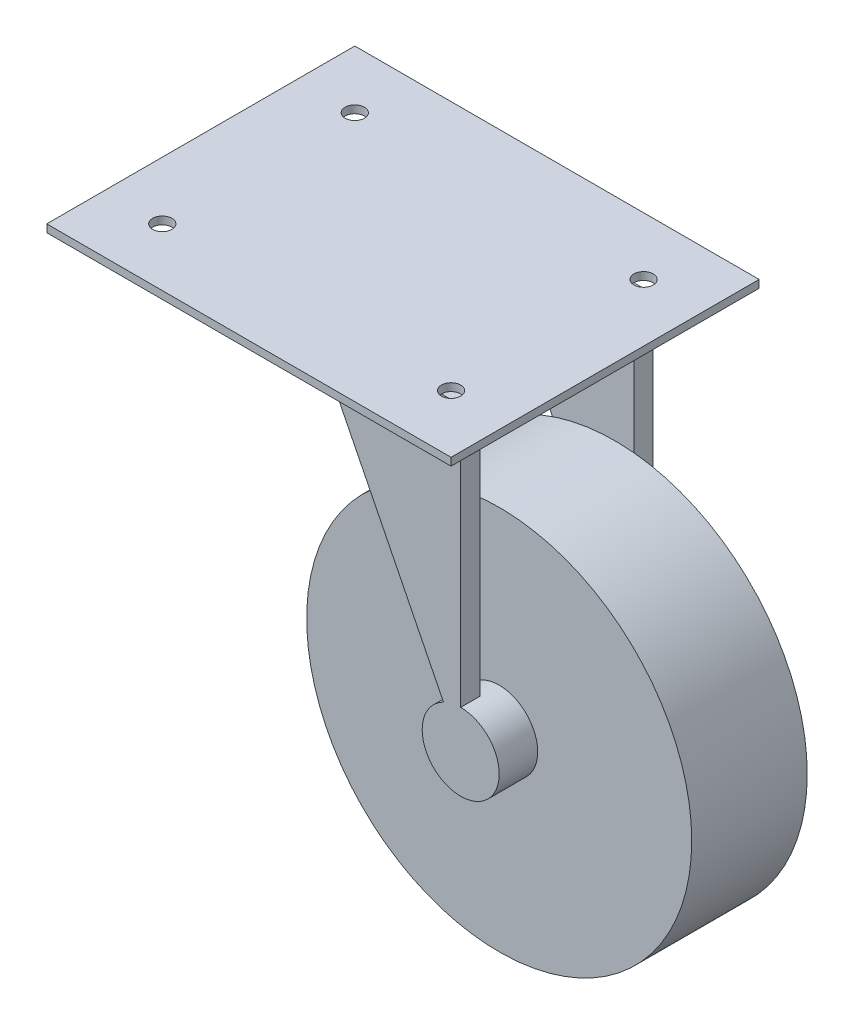
ISO-10303-21;
HEADER;
FILE_DESCRIPTION(('STEP AP214'),'2;1');
FILE_NAME('part.step','',(''),(''),'','','');
FILE_SCHEMA(('AUTOMOTIVE_DESIGN { 1 0 10303 214 1 1 1 1 }'));
ENDSEC;
DATA;
#1=APPLICATION_CONTEXT('core data for automotive mechanical design processes');
#2=APPLICATION_PROTOCOL_DEFINITION('international standard','automotive_design',2000,#1);
#3=PRODUCT_CONTEXT('',#1,'mechanical');
#4=PRODUCT('Part','Part','',(#3));
#5=PRODUCT_RELATED_PRODUCT_CATEGORY('part','',(#4));
#6=PRODUCT_DEFINITION_FORMATION('','',#4);
#7=PRODUCT_DEFINITION_CONTEXT('part definition',#1,'design');
#8=PRODUCT_DEFINITION('design','',#6,#7);
#9=PRODUCT_DEFINITION_SHAPE('','',#8);
#10=(LENGTH_UNIT() NAMED_UNIT(*) SI_UNIT(.MILLI.,.METRE.));
#11=(NAMED_UNIT(*) PLANE_ANGLE_UNIT() SI_UNIT($,.RADIAN.));
#12=(NAMED_UNIT(*) SI_UNIT($,.STERADIAN.) SOLID_ANGLE_UNIT());
#13=UNCERTAINTY_MEASURE_WITH_UNIT(LENGTH_MEASURE(1.E-05),#10,'distance_accuracy_value','');
#14=(GEOMETRIC_REPRESENTATION_CONTEXT(3) GLOBAL_UNCERTAINTY_ASSIGNED_CONTEXT((#13)) GLOBAL_UNIT_ASSIGNED_CONTEXT((#10,
#11,#12)) REPRESENTATION_CONTEXT('',''));
#15=CARTESIAN_POINT('',(0.,0.,0.));
#16=DIRECTION('',(0.,0.,1.));
#17=DIRECTION('',(1.,0.,0.));
#18=AXIS2_PLACEMENT_3D('',#15,#16,#17);
#19=CARTESIAN_POINT('',(0.,0.,35.));
#20=DIRECTION('',(0.,0.,1.));
#21=DIRECTION('',(1.,0.,0.));
#22=AXIS2_PLACEMENT_3D('',#19,#20,#21);
#23=PLANE('',#22);
#24=DIRECTION('',(-1.,0.,0.));
#25=VECTOR('',#24,1.);
#26=CARTESIAN_POINT('',(0.,78.,35.));
#27=LINE('',#26,#25);
#28=CARTESIAN_POINT('',(0.,78.,35.));
#29=VERTEX_POINT('',#28);
#30=CARTESIAN_POINT('',(-39.,78.,35.));
#31=VERTEX_POINT('',#30);
#32=EDGE_CURVE('E173',#29,#31,#27,.T.);
#33=ORIENTED_EDGE('',*,*,#32,.F.);
#34=DIRECTION('',(0.,1.,0.));
#35=VECTOR('',#34,1.);
#36=CARTESIAN_POINT('',(0.,0.,35.));
#37=LINE('',#36,#35);
#38=CARTESIAN_POINT('',(0.,10.,35.));
#39=VERTEX_POINT('',#38);
#40=EDGE_CURVE('E207',#39,#29,#37,.T.);
#41=ORIENTED_EDGE('',*,*,#40,.F.);
#42=CARTESIAN_POINT('',(0.,0.,35.));
#43=DIRECTION('',(0.,0.,1.));
#44=DIRECTION('',(1.,0.,0.));
#45=AXIS2_PLACEMENT_3D('',#42,#43,#44);
#46=CIRCLE('',#45,10.);
#47=CARTESIAN_POINT('',(-4.47213595499958,8.94427190999916,35.));
#48=VERTEX_POINT('',#47);
#49=EDGE_CURVE('E228',#39,#48,#46,.T.);
#50=ORIENTED_EDGE('',*,*,#49,.T.);
#51=DIRECTION('',(0.447213595499958,-0.894427190999916,0.));
#52=VECTOR('',#51,1.);
#53=CARTESIAN_POINT('',(0.,0.,35.));
#54=LINE('',#53,#52);
#55=EDGE_CURVE('E202',#31,#48,#54,.T.);
#56=ORIENTED_EDGE('',*,*,#55,.F.);
#57=EDGE_LOOP('',(#33,#41,#50,#56));
#58=FACE_BOUND('',#57,.T.);
#59=ADVANCED_FACE('F41',(#58),#23,.F.);
#60=CARTESIAN_POINT('',(0.,0.,40.));
#61=DIRECTION('',(0.894427190999916,0.447213595499958,0.));
#62=DIRECTION('',(-0.447213595499958,0.894427190999916,0.));
#63=AXIS2_PLACEMENT_3D('',#60,#61,#62);
#64=PLANE('',#63);
#65=DIRECTION('',(0.,0.,1.));
#66=VECTOR('',#65,1.);
#67=CARTESIAN_POINT('',(-39.,78.,40.));
#68=LINE('',#67,#66);
#69=CARTESIAN_POINT('',(-39.,78.,40.));
#70=VERTEX_POINT('',#69);
#71=EDGE_CURVE('E155',#31,#70,#68,.T.);
#72=ORIENTED_EDGE('',*,*,#71,.F.);
#73=ORIENTED_EDGE('',*,*,#55,.T.);
#74=DIRECTION('',(0.,0.,-1.));
#75=VECTOR('',#74,1.);
#76=CARTESIAN_POINT('',(-4.47213595499958,8.94427190999916,40.));
#77=LINE('',#76,#75);
#78=CARTESIAN_POINT('',(-4.47213595499958,8.94427190999916,40.));
#79=VERTEX_POINT('',#78);
#80=EDGE_CURVE('E221',#79,#48,#77,.T.);
#81=ORIENTED_EDGE('',*,*,#80,.F.);
#82=DIRECTION('',(0.447213595499958,-0.894427190999916,0.));
#83=VECTOR('',#82,1.);
#84=CARTESIAN_POINT('',(0.,0.,40.));
#85=LINE('',#84,#83);
#86=EDGE_CURVE('E203',#70,#79,#85,.T.);
#87=ORIENTED_EDGE('',*,*,#86,.F.);
#88=EDGE_LOOP('',(#72,#73,#81,#87));
#89=FACE_BOUND('',#88,.T.);
#90=ADVANCED_FACE('F265',(#89),#64,.F.);
#91=CARTESIAN_POINT('',(0.,0.,40.));
#92=DIRECTION('',(-1.,0.,0.));
#93=DIRECTION('',(0.,0.,1.));
#94=AXIS2_PLACEMENT_3D('',#91,#92,#93);
#95=PLANE('',#94);
#96=DIRECTION('',(0.,0.,-1.));
#97=VECTOR('',#96,1.);
#98=CARTESIAN_POINT('',(0.,78.,40.));
#99=LINE('',#98,#97);
#100=CARTESIAN_POINT('',(0.,78.,40.));
#101=VERTEX_POINT('',#100);
#102=EDGE_CURVE('E165',#101,#29,#99,.T.);
#103=ORIENTED_EDGE('',*,*,#102,.F.);
#104=DIRECTION('',(0.,1.,0.));
#105=VECTOR('',#104,1.);
#106=CARTESIAN_POINT('',(0.,0.,40.));
#107=LINE('',#106,#105);
#108=CARTESIAN_POINT('',(0.,10.,40.));
#109=VERTEX_POINT('',#108);
#110=EDGE_CURVE('E163',#109,#101,#107,.T.);
#111=ORIENTED_EDGE('',*,*,#110,.F.);
#112=DIRECTION('',(0.,0.,-1.));
#113=VECTOR('',#112,1.);
#114=CARTESIAN_POINT('',(0.,10.,40.));
#115=LINE('',#114,#113);
#116=EDGE_CURVE('E212',#109,#39,#115,.T.);
#117=ORIENTED_EDGE('',*,*,#116,.T.);
#118=ORIENTED_EDGE('',*,*,#40,.T.);
#119=EDGE_LOOP('',(#103,#111,#117,#118));
#120=FACE_BOUND('',#119,.T.);
#121=ADVANCED_FACE('F271',(#120),#95,.F.);
#122=CARTESIAN_POINT('',(0.,0.,40.));
#123=DIRECTION('',(0.,0.,1.));
#124=DIRECTION('',(1.,0.,0.));
#125=AXIS2_PLACEMENT_3D('',#122,#123,#124);
#126=PLANE('',#125);
#127=ORIENTED_EDGE('',*,*,#110,.T.);
#128=DIRECTION('',(-1.,0.,0.));
#129=VECTOR('',#128,1.);
#130=CARTESIAN_POINT('',(0.,78.,40.));
#131=LINE('',#130,#129);
#132=CARTESIAN_POINT('',(-5.00000000000001,78.,40.));
#133=VERTEX_POINT('',#132);
#134=EDGE_CURVE('E140',#101,#133,#131,.T.);
#135=ORIENTED_EDGE('',*,*,#134,.T.);
#136=EDGE_CURVE('E64',#133,#70,#131,.T.);
#137=ORIENTED_EDGE('',*,*,#136,.T.);
#138=ORIENTED_EDGE('',*,*,#86,.T.);
#139=CARTESIAN_POINT('',(0.,0.,40.));
#140=DIRECTION('',(0.,0.,1.));
#141=DIRECTION('',(1.,0.,0.));
#142=AXIS2_PLACEMENT_3D('',#139,#140,#141);
#143=CIRCLE('',#142,10.);
#144=EDGE_CURVE('E206',#79,#109,#143,.T.);
#145=ORIENTED_EDGE('',*,*,#144,.T.);
#146=EDGE_LOOP('',(#127,#135,#137,#138,#145));
#147=FACE_BOUND('',#146,.T.);
#148=ADVANCED_FACE('F161',(#147),#126,.T.);
#149=CARTESIAN_POINT('',(0.,0.,-5.));
#150=DIRECTION('',(0.,0.,-1.));
#151=DIRECTION('',(-1.,0.,0.));
#152=AXIS2_PLACEMENT_3D('',#149,#150,#151);
#153=PLANE('',#152);
#154=DIRECTION('',(1.,0.,0.));
#155=VECTOR('',#154,1.);
#156=CARTESIAN_POINT('',(0.,78.,-5.));
#157=LINE('',#156,#155);
#158=CARTESIAN_POINT('',(-39.,78.,-5.));
#159=VERTEX_POINT('',#158);
#160=CARTESIAN_POINT('',(0.,78.,-5.));
#161=VERTEX_POINT('',#160);
#162=EDGE_CURVE('E158',#159,#161,#157,.T.);
#163=ORIENTED_EDGE('',*,*,#162,.F.);
#164=DIRECTION('',(0.447213595499958,-0.894427190999916,0.));
#165=VECTOR('',#164,1.);
#166=CARTESIAN_POINT('',(0.,0.,-5.));
#167=LINE('',#166,#165);
#168=CARTESIAN_POINT('',(-4.47213595499958,8.94427190999916,-5.));
#169=VERTEX_POINT('',#168);
#170=EDGE_CURVE('E176',#159,#169,#167,.T.);
#171=ORIENTED_EDGE('',*,*,#170,.T.);
#172=CARTESIAN_POINT('',(0.,0.,-5.));
#173=DIRECTION('',(0.,0.,-1.));
#174=DIRECTION('',(-1.,0.,0.));
#175=AXIS2_PLACEMENT_3D('',#172,#173,#174);
#176=CIRCLE('',#175,10.);
#177=CARTESIAN_POINT('',(0.,10.,-5.));
#178=VERTEX_POINT('',#177);
#179=EDGE_CURVE('E225',#169,#178,#176,.T.);
#180=ORIENTED_EDGE('',*,*,#179,.T.);
#181=DIRECTION('',(0.,1.,0.));
#182=VECTOR('',#181,1.);
#183=CARTESIAN_POINT('',(0.,0.,-5.));
#184=LINE('',#183,#182);
#185=EDGE_CURVE('E181',#178,#161,#184,.T.);
#186=ORIENTED_EDGE('',*,*,#185,.T.);
#187=EDGE_LOOP('',(#163,#171,#180,#186));
#188=FACE_BOUND('',#187,.T.);
#189=ADVANCED_FACE('F317',(#188),#153,.F.);
#190=CARTESIAN_POINT('',(0.,0.,-10.));
#191=DIRECTION('',(-0.894427190999916,-0.447213595499958,0.));
#192=DIRECTION('',(0.447213595499958,-0.894427190999916,0.));
#193=AXIS2_PLACEMENT_3D('',#190,#191,#192);
#194=PLANE('',#193);
#195=ORIENTED_EDGE('',*,*,#170,.F.);
#196=DIRECTION('',(0.,0.,-1.));
#197=VECTOR('',#196,1.);
#198=CARTESIAN_POINT('',(-39.,78.,-10.));
#199=LINE('',#198,#197);
#200=CARTESIAN_POINT('',(-39.,78.,-10.));
#201=VERTEX_POINT('',#200);
#202=EDGE_CURVE('E306',#159,#201,#199,.T.);
#203=ORIENTED_EDGE('',*,*,#202,.T.);
#204=DIRECTION('',(0.447213595499958,-0.894427190999916,0.));
#205=VECTOR('',#204,1.);
#206=CARTESIAN_POINT('',(0.,0.,-10.));
#207=LINE('',#206,#205);
#208=CARTESIAN_POINT('',(-4.47213595499958,8.94427190999916,-10.));
#209=VERTEX_POINT('',#208);
#210=EDGE_CURVE('E177',#201,#209,#207,.T.);
#211=ORIENTED_EDGE('',*,*,#210,.T.);
#212=DIRECTION('',(0.,0.,1.));
#213=VECTOR('',#212,1.);
#214=CARTESIAN_POINT('',(-4.47213595499958,8.94427190999916,-10.));
#215=LINE('',#214,#213);
#216=EDGE_CURVE('E189',#209,#169,#215,.T.);
#217=ORIENTED_EDGE('',*,*,#216,.T.);
#218=EDGE_LOOP('',(#195,#203,#211,#217));
#219=FACE_BOUND('',#218,.T.);
#220=ADVANCED_FACE('F303',(#219),#194,.T.);
#221=CARTESIAN_POINT('',(0.,0.,-10.));
#222=DIRECTION('',(1.,0.,0.));
#223=DIRECTION('',(0.,0.,-1.));
#224=AXIS2_PLACEMENT_3D('',#221,#222,#223);
#225=PLANE('',#224);
#226=DIRECTION('',(0.,1.,0.));
#227=VECTOR('',#226,1.);
#228=CARTESIAN_POINT('',(0.,0.,-10.));
#229=LINE('',#228,#227);
#230=CARTESIAN_POINT('',(0.,10.,-10.));
#231=VERTEX_POINT('',#230);
#232=CARTESIAN_POINT('',(0.,78.,-9.99999999999999));
#233=VERTEX_POINT('',#232);
#234=EDGE_CURVE('E180',#231,#233,#229,.T.);
#235=ORIENTED_EDGE('',*,*,#234,.T.);
#236=DIRECTION('',(0.,0.,1.));
#237=VECTOR('',#236,1.);
#238=CARTESIAN_POINT('',(0.,78.,-10.));
#239=LINE('',#238,#237);
#240=EDGE_CURVE('E315',#233,#161,#239,.T.);
#241=ORIENTED_EDGE('',*,*,#240,.T.);
#242=ORIENTED_EDGE('',*,*,#185,.F.);
#243=DIRECTION('',(0.,0.,1.));
#244=VECTOR('',#243,1.);
#245=CARTESIAN_POINT('',(0.,10.,-10.));
#246=LINE('',#245,#244);
#247=EDGE_CURVE('E198',#231,#178,#246,.T.);
#248=ORIENTED_EDGE('',*,*,#247,.F.);
#249=EDGE_LOOP('',(#235,#241,#242,#248));
#250=FACE_BOUND('',#249,.T.);
#251=ADVANCED_FACE('F314',(#250),#225,.T.);
#252=CARTESIAN_POINT('',(0.,0.,-10.));
#253=DIRECTION('',(0.,0.,-1.));
#254=DIRECTION('',(-1.,0.,0.));
#255=AXIS2_PLACEMENT_3D('',#252,#253,#254);
#256=PLANE('',#255);
#257=ORIENTED_EDGE('',*,*,#210,.F.);
#258=DIRECTION('',(1.,0.,0.));
#259=VECTOR('',#258,1.);
#260=CARTESIAN_POINT('',(0.,78.,-10.));
#261=LINE('',#260,#259);
#262=CARTESIAN_POINT('',(-5.00000000000001,78.,-10.));
#263=VERTEX_POINT('',#262);
#264=EDGE_CURVE('E11',#201,#263,#261,.T.);
#265=ORIENTED_EDGE('',*,*,#264,.T.);
#266=EDGE_CURVE('E50',#263,#233,#261,.T.);
#267=ORIENTED_EDGE('',*,*,#266,.T.);
#268=ORIENTED_EDGE('',*,*,#234,.F.);
#269=CARTESIAN_POINT('',(0.,0.,-10.));
#270=DIRECTION('',(0.,0.,-1.));
#271=DIRECTION('',(-1.,0.,0.));
#272=AXIS2_PLACEMENT_3D('',#269,#270,#271);
#273=CIRCLE('',#272,10.);
#274=EDGE_CURVE('E185',#231,#209,#273,.T.);
#275=ORIENTED_EDGE('',*,*,#274,.T.);
#276=EDGE_LOOP('',(#257,#265,#267,#268,#275));
#277=FACE_BOUND('',#276,.T.);
#278=ADVANCED_FACE('F309',(#277),#256,.T.);
#279=CARTESIAN_POINT('',(0.,0.,30.));
#280=DIRECTION('',(0.,0.,-1.));
#281=DIRECTION('',(-1.,0.,0.));
#282=AXIS2_PLACEMENT_3D('',#279,#280,#281);
#283=CYLINDRICAL_SURFACE('',#282,50.);
#284=CARTESIAN_POINT('',(0.,0.,30.));
#285=DIRECTION('',(0.,0.,1.));
#286=DIRECTION('',(1.,0.,0.));
#287=AXIS2_PLACEMENT_3D('',#284,#285,#286);
#288=CIRCLE('',#287,50.);
#289=CARTESIAN_POINT('',(50.,0.,30.));
#290=VERTEX_POINT('',#289);
#291=EDGE_CURVE('E241',#290,#290,#288,.T.);
#292=ORIENTED_EDGE('',*,*,#291,.F.);
#293=EDGE_LOOP('',(#292));
#294=FACE_BOUND('',#293,.T.);
#295=CARTESIAN_POINT('',(0.,0.,0.));
#296=DIRECTION('',(0.,0.,1.));
#297=DIRECTION('',(1.,0.,0.));
#298=AXIS2_PLACEMENT_3D('',#295,#296,#297);
#299=CIRCLE('',#298,50.);
#300=CARTESIAN_POINT('',(50.,0.,0.));
#301=VERTEX_POINT('',#300);
#302=EDGE_CURVE('E237',#301,#301,#299,.T.);
#303=ORIENTED_EDGE('',*,*,#302,.T.);
#304=EDGE_LOOP('',(#303));
#305=FACE_BOUND('',#304,.T.);
#306=ADVANCED_FACE('F43',(#294,#305),#283,.T.);
#307=CARTESIAN_POINT('',(0.,0.,30.));
#308=DIRECTION('',(0.,0.,1.));
#309=DIRECTION('',(1.,0.,0.));
#310=AXIS2_PLACEMENT_3D('',#307,#308,#309);
#311=PLANE('',#310);
#312=CARTESIAN_POINT('',(0.,0.,30.));
#313=DIRECTION('',(0.,0.,1.));
#314=DIRECTION('',(1.,0.,0.));
#315=AXIS2_PLACEMENT_3D('',#312,#313,#314);
#316=CIRCLE('',#315,10.);
#317=CARTESIAN_POINT('',(10.,0.,30.));
#318=VERTEX_POINT('',#317);
#319=EDGE_CURVE('E233',#318,#318,#316,.T.);
#320=ORIENTED_EDGE('',*,*,#319,.F.);
#321=EDGE_LOOP('',(#320));
#322=FACE_BOUND('',#321,.T.);
#323=ORIENTED_EDGE('',*,*,#291,.T.);
#324=EDGE_LOOP('',(#323));
#325=FACE_BOUND('',#324,.T.);
#326=ADVANCED_FACE('F252',(#322,#325),#311,.T.);
#327=CARTESIAN_POINT('',(0.,0.,0.));
#328=DIRECTION('',(0.,0.,1.));
#329=DIRECTION('',(1.,0.,0.));
#330=AXIS2_PLACEMENT_3D('',#327,#328,#329);
#331=PLANE('',#330);
#332=CARTESIAN_POINT('',(0.,0.,0.));
#333=DIRECTION('',(0.,0.,-1.));
#334=DIRECTION('',(-1.,0.,0.));
#335=AXIS2_PLACEMENT_3D('',#332,#333,#334);
#336=CIRCLE('',#335,10.);
#337=CARTESIAN_POINT('',(-10.,0.,0.));
#338=VERTEX_POINT('',#337);
#339=EDGE_CURVE('E229',#338,#338,#336,.T.);
#340=ORIENTED_EDGE('',*,*,#339,.F.);
#341=EDGE_LOOP('',(#340));
#342=FACE_BOUND('',#341,.T.);
#343=ORIENTED_EDGE('',*,*,#302,.F.);
#344=EDGE_LOOP('',(#343));
#345=FACE_BOUND('',#344,.T.);
#346=ADVANCED_FACE('F249',(#342,#345),#331,.F.);
#347=CARTESIAN_POINT('',(0.,0.,35.));
#348=DIRECTION('',(0.,0.,-1.));
#349=DIRECTION('',(-1.,0.,0.));
#350=AXIS2_PLACEMENT_3D('',#347,#348,#349);
#351=CYLINDRICAL_SURFACE('',#350,10.);
#352=ORIENTED_EDGE('',*,*,#49,.F.);
#353=ORIENTED_EDGE('',*,*,#116,.F.);
#354=ORIENTED_EDGE('',*,*,#144,.F.);
#355=ORIENTED_EDGE('',*,*,#80,.T.);
#356=EDGE_LOOP('',(#352,#353,#354,#355));
#357=FACE_BOUND('',#356,.T.);
#358=ORIENTED_EDGE('',*,*,#319,.T.);
#359=EDGE_LOOP('',(#358));
#360=FACE_BOUND('',#359,.T.);
#361=ADVANCED_FACE('F251',(#357,#360),#351,.T.);
#362=CARTESIAN_POINT('',(0.,0.,-5.));
#363=DIRECTION('',(0.,0.,1.));
#364=DIRECTION('',(1.,0.,0.));
#365=AXIS2_PLACEMENT_3D('',#362,#363,#364);
#366=CYLINDRICAL_SURFACE('',#365,10.);
#367=ORIENTED_EDGE('',*,*,#179,.F.);
#368=ORIENTED_EDGE('',*,*,#216,.F.);
#369=ORIENTED_EDGE('',*,*,#274,.F.);
#370=ORIENTED_EDGE('',*,*,#247,.T.);
#371=EDGE_LOOP('',(#367,#368,#369,#370));
#372=FACE_BOUND('',#371,.T.);
#373=ORIENTED_EDGE('',*,*,#339,.T.);
#374=EDGE_LOOP('',(#373));
#375=FACE_BOUND('',#374,.T.);
#376=ADVANCED_FACE('F258',(#372,#375),#366,.T.);
#377=CARTESIAN_POINT('',(0.,78.,0.));
#378=DIRECTION('',(0.,1.,0.));
#379=DIRECTION('',(0.,0.,1.));
#380=AXIS2_PLACEMENT_3D('',#377,#378,#379);
#381=PLANE('',#380);
#382=CARTESIAN_POINT('',(-77.5,78.,-9.99999999999999));
#383=DIRECTION('',(0.,1.,0.));
#384=DIRECTION('',(0.,0.,-1.));
#385=AXIS2_PLACEMENT_3D('',#382,#383,#384);
#386=CIRCLE('',#385,2.50000000000001);
#387=CARTESIAN_POINT('',(-77.5,78.,-12.5));
#388=VERTEX_POINT('',#387);
#389=EDGE_CURVE('E379',#388,#388,#386,.T.);
#390=ORIENTED_EDGE('',*,*,#389,.T.);
#391=EDGE_LOOP('',(#390));
#392=FACE_BOUND('',#391,.T.);
#393=CARTESIAN_POINT('',(-77.5,78.,40.));
#394=DIRECTION('',(0.,1.,0.));
#395=DIRECTION('',(0.,0.,1.));
#396=AXIS2_PLACEMENT_3D('',#393,#394,#395);
#397=CIRCLE('',#396,2.50000000000001);
#398=CARTESIAN_POINT('',(-77.5,78.,42.5));
#399=VERTEX_POINT('',#398);
#400=EDGE_CURVE('E354',#399,#399,#397,.T.);
#401=ORIENTED_EDGE('',*,*,#400,.T.);
#402=EDGE_LOOP('',(#401));
#403=FACE_BOUND('',#402,.T.);
#404=DIRECTION('',(0.,0.,-1.));
#405=VECTOR('',#404,1.);
#406=CARTESIAN_POINT('',(12.5,78.,-25.));
#407=LINE('',#406,#405);
#408=CARTESIAN_POINT('',(12.5,78.,55.));
#409=VERTEX_POINT('',#408);
#410=CARTESIAN_POINT('',(12.5,78.,-25.));
#411=VERTEX_POINT('',#410);
#412=EDGE_CURVE('E341',#409,#411,#407,.T.);
#413=ORIENTED_EDGE('',*,*,#412,.F.);
#414=DIRECTION('',(1.,0.,0.));
#415=VECTOR('',#414,1.);
#416=CARTESIAN_POINT('',(-92.5,78.,55.));
#417=LINE('',#416,#415);
#418=CARTESIAN_POINT('',(-92.5,78.,55.));
#419=VERTEX_POINT('',#418);
#420=EDGE_CURVE('E329',#419,#409,#417,.T.);
#421=ORIENTED_EDGE('',*,*,#420,.F.);
#422=DIRECTION('',(0.,0.,1.));
#423=VECTOR('',#422,1.);
#424=CARTESIAN_POINT('',(-92.5,78.,-25.));
#425=LINE('',#424,#423);
#426=CARTESIAN_POINT('',(-92.5,78.,-25.));
#427=VERTEX_POINT('',#426);
#428=EDGE_CURVE('E358',#427,#419,#425,.T.);
#429=ORIENTED_EDGE('',*,*,#428,.F.);
#430=DIRECTION('',(-1.,0.,0.));
#431=VECTOR('',#430,1.);
#432=CARTESIAN_POINT('',(-92.5,78.,-25.));
#433=LINE('',#432,#431);
#434=EDGE_CURVE('E362',#411,#427,#433,.T.);
#435=ORIENTED_EDGE('',*,*,#434,.F.);
#436=EDGE_LOOP('',(#413,#421,#429,#435));
#437=FACE_BOUND('',#436,.T.);
#438=ORIENTED_EDGE('',*,*,#240,.F.);
#439=CARTESIAN_POINT('',(-2.5,78.,-9.99999999999999));
#440=DIRECTION('',(0.,1.,0.));
#441=DIRECTION('',(0.,0.,1.));
#442=AXIS2_PLACEMENT_3D('',#439,#440,#441);
#443=CIRCLE('',#442,2.50000000000001);
#444=EDGE_CURVE('E387',#233,#263,#443,.T.);
#445=ORIENTED_EDGE('',*,*,#444,.T.);
#446=ORIENTED_EDGE('',*,*,#264,.F.);
#447=ORIENTED_EDGE('',*,*,#202,.F.);
#448=ORIENTED_EDGE('',*,*,#162,.T.);
#449=EDGE_LOOP('',(#438,#445,#446,#447,#448));
#450=FACE_BOUND('',#449,.T.);
#451=ORIENTED_EDGE('',*,*,#136,.F.);
#452=CARTESIAN_POINT('',(-2.5,78.,40.));
#453=DIRECTION('',(0.,1.,0.));
#454=DIRECTION('',(0.,0.,-1.));
#455=AXIS2_PLACEMENT_3D('',#452,#453,#454);
#456=CIRCLE('',#455,2.50000000000001);
#457=EDGE_CURVE('E144',#133,#101,#456,.T.);
#458=ORIENTED_EDGE('',*,*,#457,.T.);
#459=ORIENTED_EDGE('',*,*,#102,.T.);
#460=ORIENTED_EDGE('',*,*,#32,.T.);
#461=ORIENTED_EDGE('',*,*,#71,.T.);
#462=EDGE_LOOP('',(#451,#458,#459,#460,#461));
#463=FACE_BOUND('',#462,.T.);
#464=ADVANCED_FACE('F153',(#392,#403,#437,#450,#463),#381,.F.);
#465=CARTESIAN_POINT('',(12.5,78.,-25.));
#466=DIRECTION('',(1.,0.,0.));
#467=DIRECTION('',(0.,0.,-1.));
#468=AXIS2_PLACEMENT_3D('',#465,#466,#467);
#469=PLANE('',#468);
#470=DIRECTION('',(0.,0.,-1.));
#471=VECTOR('',#470,1.);
#472=CARTESIAN_POINT('',(12.5,80.,-25.));
#473=LINE('',#472,#471);
#474=CARTESIAN_POINT('',(12.5,80.,55.));
#475=VERTEX_POINT('',#474);
#476=CARTESIAN_POINT('',(12.5,80.,-25.));
#477=VERTEX_POINT('',#476);
#478=EDGE_CURVE('E350',#475,#477,#473,.T.);
#479=ORIENTED_EDGE('',*,*,#478,.F.);
#480=DIRECTION('',(0.,1.,0.));
#481=VECTOR('',#480,1.);
#482=CARTESIAN_POINT('',(12.5,78.,55.));
#483=LINE('',#482,#481);
#484=EDGE_CURVE('E322',#409,#475,#483,.T.);
#485=ORIENTED_EDGE('',*,*,#484,.F.);
#486=ORIENTED_EDGE('',*,*,#412,.T.);
#487=DIRECTION('',(0.,1.,0.));
#488=VECTOR('',#487,1.);
#489=CARTESIAN_POINT('',(12.5,78.,-25.));
#490=LINE('',#489,#488);
#491=EDGE_CURVE('E325',#411,#477,#490,.T.);
#492=ORIENTED_EDGE('',*,*,#491,.T.);
#493=EDGE_LOOP('',(#479,#485,#486,#492));
#494=FACE_BOUND('',#493,.T.);
#495=ADVANCED_FACE('F292',(#494),#469,.T.);
#496=CARTESIAN_POINT('',(-92.5,78.,55.));
#497=DIRECTION('',(0.,0.,1.));
#498=DIRECTION('',(1.,0.,0.));
#499=AXIS2_PLACEMENT_3D('',#496,#497,#498);
#500=PLANE('',#499);
#501=DIRECTION('',(1.,0.,0.));
#502=VECTOR('',#501,1.);
#503=CARTESIAN_POINT('',(-92.5,80.,55.));
#504=LINE('',#503,#502);
#505=CARTESIAN_POINT('',(-92.5,80.,55.));
#506=VERTEX_POINT('',#505);
#507=EDGE_CURVE('E337',#506,#475,#504,.T.);
#508=ORIENTED_EDGE('',*,*,#507,.F.);
#509=DIRECTION('',(0.,1.,0.));
#510=VECTOR('',#509,1.);
#511=CARTESIAN_POINT('',(-92.5,78.,55.));
#512=LINE('',#511,#510);
#513=EDGE_CURVE('E332',#419,#506,#512,.T.);
#514=ORIENTED_EDGE('',*,*,#513,.F.);
#515=ORIENTED_EDGE('',*,*,#420,.T.);
#516=ORIENTED_EDGE('',*,*,#484,.T.);
#517=EDGE_LOOP('',(#508,#514,#515,#516));
#518=FACE_BOUND('',#517,.T.);
#519=ADVANCED_FACE('F410',(#518),#500,.T.);
#520=CARTESIAN_POINT('',(-92.5,78.,-25.));
#521=DIRECTION('',(-1.,0.,0.));
#522=DIRECTION('',(0.,0.,1.));
#523=AXIS2_PLACEMENT_3D('',#520,#521,#522);
#524=PLANE('',#523);
#525=DIRECTION('',(0.,0.,1.));
#526=VECTOR('',#525,1.);
#527=CARTESIAN_POINT('',(-92.5,80.,-25.));
#528=LINE('',#527,#526);
#529=CARTESIAN_POINT('',(-92.5,80.,-25.));
#530=VERTEX_POINT('',#529);
#531=EDGE_CURVE('E342',#530,#506,#528,.T.);
#532=ORIENTED_EDGE('',*,*,#531,.F.);
#533=DIRECTION('',(0.,1.,0.));
#534=VECTOR('',#533,1.);
#535=CARTESIAN_POINT('',(-92.5,78.,-25.));
#536=LINE('',#535,#534);
#537=EDGE_CURVE('E328',#427,#530,#536,.T.);
#538=ORIENTED_EDGE('',*,*,#537,.F.);
#539=ORIENTED_EDGE('',*,*,#428,.T.);
#540=ORIENTED_EDGE('',*,*,#513,.T.);
#541=EDGE_LOOP('',(#532,#538,#539,#540));
#542=FACE_BOUND('',#541,.T.);
#543=ADVANCED_FACE('F408',(#542),#524,.T.);
#544=CARTESIAN_POINT('',(-92.5,78.,-25.));
#545=DIRECTION('',(0.,0.,-1.));
#546=DIRECTION('',(-1.,0.,0.));
#547=AXIS2_PLACEMENT_3D('',#544,#545,#546);
#548=PLANE('',#547);
#549=DIRECTION('',(-1.,0.,0.));
#550=VECTOR('',#549,1.);
#551=CARTESIAN_POINT('',(-92.5,80.,-25.));
#552=LINE('',#551,#550);
#553=EDGE_CURVE('E346',#477,#530,#552,.T.);
#554=ORIENTED_EDGE('',*,*,#553,.F.);
#555=ORIENTED_EDGE('',*,*,#491,.F.);
#556=ORIENTED_EDGE('',*,*,#434,.T.);
#557=ORIENTED_EDGE('',*,*,#537,.T.);
#558=EDGE_LOOP('',(#554,#555,#556,#557));
#559=FACE_BOUND('',#558,.T.);
#560=ADVANCED_FACE('F285',(#559),#548,.T.);
#561=CARTESIAN_POINT('',(0.,80.,40.));
#562=DIRECTION('',(0.,-1.,0.));
#563=DIRECTION('',(0.,0.,-1.));
#564=AXIS2_PLACEMENT_3D('',#561,#562,#563);
#565=PLANE('',#564);
#566=CARTESIAN_POINT('',(-77.5,80.,-9.99999999999999));
#567=DIRECTION('',(0.,1.,0.));
#568=DIRECTION('',(0.,0.,-1.));
#569=AXIS2_PLACEMENT_3D('',#566,#567,#568);
#570=CIRCLE('',#569,2.50000000000001);
#571=CARTESIAN_POINT('',(-77.5,80.,-12.5));
#572=VERTEX_POINT('',#571);
#573=EDGE_CURVE('E375',#572,#572,#570,.T.);
#574=ORIENTED_EDGE('',*,*,#573,.F.);
#575=EDGE_LOOP('',(#574));
#576=FACE_BOUND('',#575,.T.);
#577=CARTESIAN_POINT('',(-2.5,80.,-9.99999999999999));
#578=DIRECTION('',(0.,1.,0.));
#579=DIRECTION('',(0.,0.,1.));
#580=AXIS2_PLACEMENT_3D('',#577,#578,#579);
#581=CIRCLE('',#580,2.50000000000001);
#582=CARTESIAN_POINT('',(-2.5,80.,-7.49999999999999));
#583=VERTEX_POINT('',#582);
#584=EDGE_CURVE('E383',#583,#583,#581,.T.);
#585=ORIENTED_EDGE('',*,*,#584,.F.);
#586=EDGE_LOOP('',(#585));
#587=FACE_BOUND('',#586,.T.);
#588=CARTESIAN_POINT('',(-2.5,80.,40.));
#589=DIRECTION('',(0.,1.,0.));
#590=DIRECTION('',(0.,0.,-1.));
#591=AXIS2_PLACEMENT_3D('',#588,#589,#590);
#592=CIRCLE('',#591,2.50000000000001);
#593=CARTESIAN_POINT('',(-2.5,80.,37.5));
#594=VERTEX_POINT('',#593);
#595=EDGE_CURVE('E145',#594,#594,#592,.T.);
#596=ORIENTED_EDGE('',*,*,#595,.F.);
#597=EDGE_LOOP('',(#596));
#598=FACE_BOUND('',#597,.T.);
#599=CARTESIAN_POINT('',(-77.5,80.,40.));
#600=DIRECTION('',(0.,1.,0.));
#601=DIRECTION('',(0.,0.,1.));
#602=AXIS2_PLACEMENT_3D('',#599,#600,#601);
#603=CIRCLE('',#602,2.50000000000001);
#604=CARTESIAN_POINT('',(-77.5,80.,42.5));
#605=VERTEX_POINT('',#604);
#606=EDGE_CURVE('E152',#605,#605,#603,.T.);
#607=ORIENTED_EDGE('',*,*,#606,.F.);
#608=EDGE_LOOP('',(#607));
#609=FACE_BOUND('',#608,.T.);
#610=ORIENTED_EDGE('',*,*,#478,.T.);
#611=ORIENTED_EDGE('',*,*,#553,.T.);
#612=ORIENTED_EDGE('',*,*,#531,.T.);
#613=ORIENTED_EDGE('',*,*,#507,.T.);
#614=EDGE_LOOP('',(#610,#611,#612,#613));
#615=FACE_BOUND('',#614,.T.);
#616=ADVANCED_FACE('F281',(#576,#587,#598,#609,#615),#565,.F.);
#617=CARTESIAN_POINT('',(-77.5,78.,40.));
#618=DIRECTION('',(0.,1.,0.));
#619=DIRECTION('',(0.,0.,1.));
#620=AXIS2_PLACEMENT_3D('',#617,#618,#619);
#621=CYLINDRICAL_SURFACE('',#620,2.50000000000001);
#622=ORIENTED_EDGE('',*,*,#400,.F.);
#623=EDGE_LOOP('',(#622));
#624=FACE_BOUND('',#623,.T.);
#625=ORIENTED_EDGE('',*,*,#606,.T.);
#626=EDGE_LOOP('',(#625));
#627=FACE_BOUND('',#626,.T.);
#628=ADVANCED_FACE('F284',(#624,#627),#621,.F.);
#629=CARTESIAN_POINT('',(-2.5,78.,40.));
#630=DIRECTION('',(0.,1.,0.));
#631=DIRECTION('',(0.,0.,1.));
#632=AXIS2_PLACEMENT_3D('',#629,#630,#631);
#633=CYLINDRICAL_SURFACE('',#632,2.50000000000001);
#634=ORIENTED_EDGE('',*,*,#457,.F.);
#635=EDGE_CURVE('E137',#101,#133,#456,.T.);
#636=ORIENTED_EDGE('',*,*,#635,.F.);
#637=EDGE_LOOP('',(#634,#636));
#638=FACE_BOUND('',#637,.T.);
#639=ORIENTED_EDGE('',*,*,#595,.T.);
#640=EDGE_LOOP('',(#639));
#641=FACE_BOUND('',#640,.T.);
#642=ADVANCED_FACE('F147',(#638,#641),#633,.F.);
#643=CARTESIAN_POINT('',(-2.5,78.,40.));
#644=DIRECTION('',(0.,-1.,0.));
#645=DIRECTION('',(0.,0.,-1.));
#646=AXIS2_PLACEMENT_3D('',#643,#644,#645);
#647=PLANE('',#646);
#648=ORIENTED_EDGE('',*,*,#134,.F.);
#649=ORIENTED_EDGE('',*,*,#635,.T.);
#650=EDGE_LOOP('',(#648,#649));
#651=FACE_BOUND('',#650,.T.);
#652=ADVANCED_FACE('F139',(#651),#647,.F.);
#653=CARTESIAN_POINT('',(-2.5,78.,-9.99999999999999));
#654=DIRECTION('',(0.,1.,0.));
#655=DIRECTION('',(0.,0.,1.));
#656=AXIS2_PLACEMENT_3D('',#653,#654,#655);
#657=CYLINDRICAL_SURFACE('',#656,2.50000000000001);
#658=ORIENTED_EDGE('',*,*,#444,.F.);
#659=EDGE_CURVE('E56',#263,#233,#443,.T.);
#660=ORIENTED_EDGE('',*,*,#659,.F.);
#661=EDGE_LOOP('',(#658,#660));
#662=FACE_BOUND('',#661,.T.);
#663=ORIENTED_EDGE('',*,*,#584,.T.);
#664=EDGE_LOOP('',(#663));
#665=FACE_BOUND('',#664,.T.);
#666=ADVANCED_FACE('F413',(#662,#665),#657,.F.);
#667=CARTESIAN_POINT('',(-2.5,78.,-9.99999999999999));
#668=DIRECTION('',(0.,1.,0.));
#669=DIRECTION('',(0.,0.,1.));
#670=AXIS2_PLACEMENT_3D('',#667,#668,#669);
#671=PLANE('',#670);
#672=ORIENTED_EDGE('',*,*,#659,.T.);
#673=ORIENTED_EDGE('',*,*,#266,.F.);
#674=EDGE_LOOP('',(#672,#673));
#675=FACE_BOUND('',#674,.T.);
#676=ADVANCED_FACE('F416',(#675),#671,.T.);
#677=CARTESIAN_POINT('',(-77.5,78.,-9.99999999999999));
#678=DIRECTION('',(0.,1.,0.));
#679=DIRECTION('',(0.,0.,1.));
#680=AXIS2_PLACEMENT_3D('',#677,#678,#679);
#681=CYLINDRICAL_SURFACE('',#680,2.50000000000001);
#682=ORIENTED_EDGE('',*,*,#389,.F.);
#683=EDGE_LOOP('',(#682));
#684=FACE_BOUND('',#683,.T.);
#685=ORIENTED_EDGE('',*,*,#573,.T.);
#686=EDGE_LOOP('',(#685));
#687=FACE_BOUND('',#686,.T.);
#688=ADVANCED_FACE('F424',(#684,#687),#681,.F.);
#689=CLOSED_SHELL('',(#59,#90,#121,#148,#189,#220,#251,#278,#306,#326,#346,#361,#376,#464,#495,
#519,#543,#560,#616,#628,#642,#652,#666,#676,#688));
#690=MANIFOLD_SOLID_BREP('B2',#689);
#691=ADVANCED_BREP_SHAPE_REPRESENTATION('',(#18,#690),#14);
#692=SHAPE_DEFINITION_REPRESENTATION(#9,#691);
ENDSEC;
END-ISO-10303-21;
